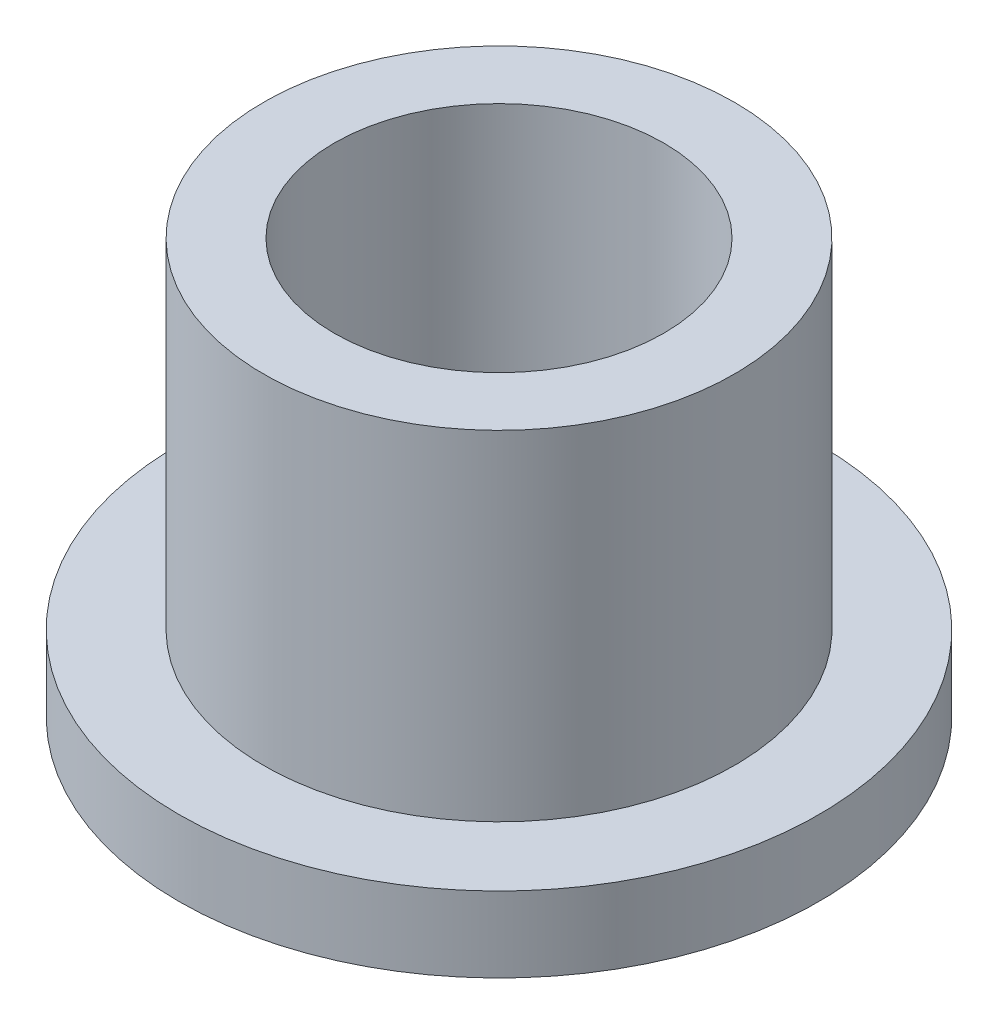
ISO-10303-21;
HEADER;
FILE_DESCRIPTION(('STEP AP214'),'2;1');
FILE_NAME('part.step','',(''),(''),'','','');
FILE_SCHEMA(('AUTOMOTIVE_DESIGN { 1 0 10303 214 1 1 1 1 }'));
ENDSEC;
DATA;
#1=APPLICATION_CONTEXT('core data for automotive mechanical design processes');
#2=APPLICATION_PROTOCOL_DEFINITION('international standard','automotive_design',2000,#1);
#3=PRODUCT_CONTEXT('',#1,'mechanical');
#4=PRODUCT('Part','Part','',(#3));
#5=PRODUCT_RELATED_PRODUCT_CATEGORY('part','',(#4));
#6=PRODUCT_DEFINITION_FORMATION('','',#4);
#7=PRODUCT_DEFINITION_CONTEXT('part definition',#1,'design');
#8=PRODUCT_DEFINITION('design','',#6,#7);
#9=PRODUCT_DEFINITION_SHAPE('','',#8);
#10=(LENGTH_UNIT() NAMED_UNIT(*) SI_UNIT(.MILLI.,.METRE.));
#11=(NAMED_UNIT(*) PLANE_ANGLE_UNIT() SI_UNIT($,.RADIAN.));
#12=(NAMED_UNIT(*) SI_UNIT($,.STERADIAN.) SOLID_ANGLE_UNIT());
#13=UNCERTAINTY_MEASURE_WITH_UNIT(LENGTH_MEASURE(1.E-05),#10,'distance_accuracy_value','');
#14=(GEOMETRIC_REPRESENTATION_CONTEXT(3) GLOBAL_UNCERTAINTY_ASSIGNED_CONTEXT((#13)) GLOBAL_UNIT_ASSIGNED_CONTEXT((#10,
#11,#12)) REPRESENTATION_CONTEXT('',''));
#15=CARTESIAN_POINT('',(0.,0.,0.));
#16=DIRECTION('',(0.,0.,1.));
#17=DIRECTION('',(1.,0.,0.));
#18=AXIS2_PLACEMENT_3D('',#15,#16,#17);
#19=CARTESIAN_POINT('',(0.,0.,0.));
#20=DIRECTION('',(0.,-1.,0.));
#21=DIRECTION('',(0.,0.,-1.));
#22=AXIS2_PLACEMENT_3D('',#19,#20,#21);
#23=PLANE('',#22);
#24=CARTESIAN_POINT('',(0.,0.,0.));
#25=DIRECTION('',(0.,-1.,0.));
#26=DIRECTION('',(0.,0.,-1.));
#27=AXIS2_PLACEMENT_3D('',#24,#25,#26);
#28=CIRCLE('',#27,17.5);
#29=CARTESIAN_POINT('',(0.,0.,-17.5));
#30=VERTEX_POINT('',#29);
#31=EDGE_CURVE('E64',#30,#30,#28,.T.);
#32=ORIENTED_EDGE('',*,*,#31,.F.);
#33=EDGE_LOOP('',(#32));
#34=FACE_BOUND('',#33,.T.);
#35=CARTESIAN_POINT('',(0.,0.,0.));
#36=DIRECTION('',(0.,-1.,0.));
#37=DIRECTION('',(0.,0.,-1.));
#38=AXIS2_PLACEMENT_3D('',#35,#36,#37);
#39=CIRCLE('',#38,34.);
#40=CARTESIAN_POINT('',(0.,0.,-34.));
#41=VERTEX_POINT('',#40);
#42=EDGE_CURVE('E10',#41,#41,#39,.T.);
#43=ORIENTED_EDGE('',*,*,#42,.T.);
#44=EDGE_LOOP('',(#43));
#45=FACE_BOUND('',#44,.T.);
#46=ADVANCED_FACE('F41',(#34,#45),#23,.T.);
#47=CARTESIAN_POINT('',(0.,0.,0.));
#48=DIRECTION('',(0.,-1.,0.));
#49=DIRECTION('',(0.,0.,-1.));
#50=AXIS2_PLACEMENT_3D('',#47,#48,#49);
#51=CYLINDRICAL_SURFACE('',#50,34.);
#52=CARTESIAN_POINT('',(0.,8.,0.));
#53=DIRECTION('',(0.,-1.,0.));
#54=DIRECTION('',(0.,0.,-1.));
#55=AXIS2_PLACEMENT_3D('',#52,#53,#54);
#56=CIRCLE('',#55,34.);
#57=CARTESIAN_POINT('',(0.,8.,-34.));
#58=VERTEX_POINT('',#57);
#59=EDGE_CURVE('E48',#58,#58,#56,.T.);
#60=ORIENTED_EDGE('',*,*,#59,.T.);
#61=EDGE_LOOP('',(#60));
#62=FACE_BOUND('',#61,.T.);
#63=ORIENTED_EDGE('',*,*,#42,.F.);
#64=EDGE_LOOP('',(#63));
#65=FACE_BOUND('',#64,.T.);
#66=ADVANCED_FACE('F90',(#62,#65),#51,.T.);
#67=CARTESIAN_POINT('',(34.,8.,0.));
#68=DIRECTION('',(0.,1.,0.));
#69=DIRECTION('',(0.,0.,1.));
#70=AXIS2_PLACEMENT_3D('',#67,#68,#69);
#71=PLANE('',#70);
#72=CARTESIAN_POINT('',(0.,8.,0.));
#73=DIRECTION('',(0.,-1.,0.));
#74=DIRECTION('',(0.,0.,-1.));
#75=AXIS2_PLACEMENT_3D('',#72,#73,#74);
#76=CIRCLE('',#75,25.);
#77=CARTESIAN_POINT('',(0.,8.,-25.));
#78=VERTEX_POINT('',#77);
#79=EDGE_CURVE('E53',#78,#78,#76,.T.);
#80=ORIENTED_EDGE('',*,*,#79,.T.);
#81=EDGE_LOOP('',(#80));
#82=FACE_BOUND('',#81,.T.);
#83=ORIENTED_EDGE('',*,*,#59,.F.);
#84=EDGE_LOOP('',(#83));
#85=FACE_BOUND('',#84,.T.);
#86=ADVANCED_FACE('F84',(#82,#85),#71,.T.);
#87=CARTESIAN_POINT('',(0.,0.,0.));
#88=DIRECTION('',(0.,-1.,0.));
#89=DIRECTION('',(0.,0.,-1.));
#90=AXIS2_PLACEMENT_3D('',#87,#88,#89);
#91=CYLINDRICAL_SURFACE('',#90,25.);
#92=CARTESIAN_POINT('',(0.,44.,0.));
#93=DIRECTION('',(0.,-1.,0.));
#94=DIRECTION('',(0.,0.,-1.));
#95=AXIS2_PLACEMENT_3D('',#92,#93,#94);
#96=CIRCLE('',#95,25.);
#97=CARTESIAN_POINT('',(0.,44.,-25.));
#98=VERTEX_POINT('',#97);
#99=EDGE_CURVE('E58',#98,#98,#96,.T.);
#100=ORIENTED_EDGE('',*,*,#99,.T.);
#101=EDGE_LOOP('',(#100));
#102=FACE_BOUND('',#101,.T.);
#103=ORIENTED_EDGE('',*,*,#79,.F.);
#104=EDGE_LOOP('',(#103));
#105=FACE_BOUND('',#104,.T.);
#106=ADVANCED_FACE('F78',(#102,#105),#91,.T.);
#107=CARTESIAN_POINT('',(25.,44.,0.));
#108=DIRECTION('',(0.,1.,0.));
#109=DIRECTION('',(0.,0.,1.));
#110=AXIS2_PLACEMENT_3D('',#107,#108,#109);
#111=PLANE('',#110);
#112=CARTESIAN_POINT('',(0.,44.,0.));
#113=DIRECTION('',(0.,1.,0.));
#114=DIRECTION('',(0.,0.,1.));
#115=AXIS2_PLACEMENT_3D('',#112,#113,#114);
#116=CIRCLE('',#115,17.5);
#117=CARTESIAN_POINT('',(0.,44.,17.5));
#118=VERTEX_POINT('',#117);
#119=EDGE_CURVE('E68',#118,#118,#116,.T.);
#120=ORIENTED_EDGE('',*,*,#119,.F.);
#121=EDGE_LOOP('',(#120));
#122=FACE_BOUND('',#121,.T.);
#123=ORIENTED_EDGE('',*,*,#99,.F.);
#124=EDGE_LOOP('',(#123));
#125=FACE_BOUND('',#124,.T.);
#126=ADVANCED_FACE('F75',(#122,#125),#111,.T.);
#127=CARTESIAN_POINT('',(0.,-6.00000000000001,0.));
#128=DIRECTION('',(0.,1.,0.));
#129=DIRECTION('',(0.,0.,1.));
#130=AXIS2_PLACEMENT_3D('',#127,#128,#129);
#131=CYLINDRICAL_SURFACE('',#130,17.5);
#132=ORIENTED_EDGE('',*,*,#31,.T.);
#133=EDGE_LOOP('',(#132));
#134=FACE_BOUND('',#133,.T.);
#135=ORIENTED_EDGE('',*,*,#119,.T.);
#136=EDGE_LOOP('',(#135));
#137=FACE_BOUND('',#136,.T.);
#138=ADVANCED_FACE('F73',(#134,#137),#131,.F.);
#139=CLOSED_SHELL('',(#46,#66,#86,#106,#126,#138));
#140=MANIFOLD_SOLID_BREP('B2',#139);
#141=ADVANCED_BREP_SHAPE_REPRESENTATION('',(#18,#140),#14);
#142=SHAPE_DEFINITION_REPRESENTATION(#9,#141);
ENDSEC;
END-ISO-10303-21;
